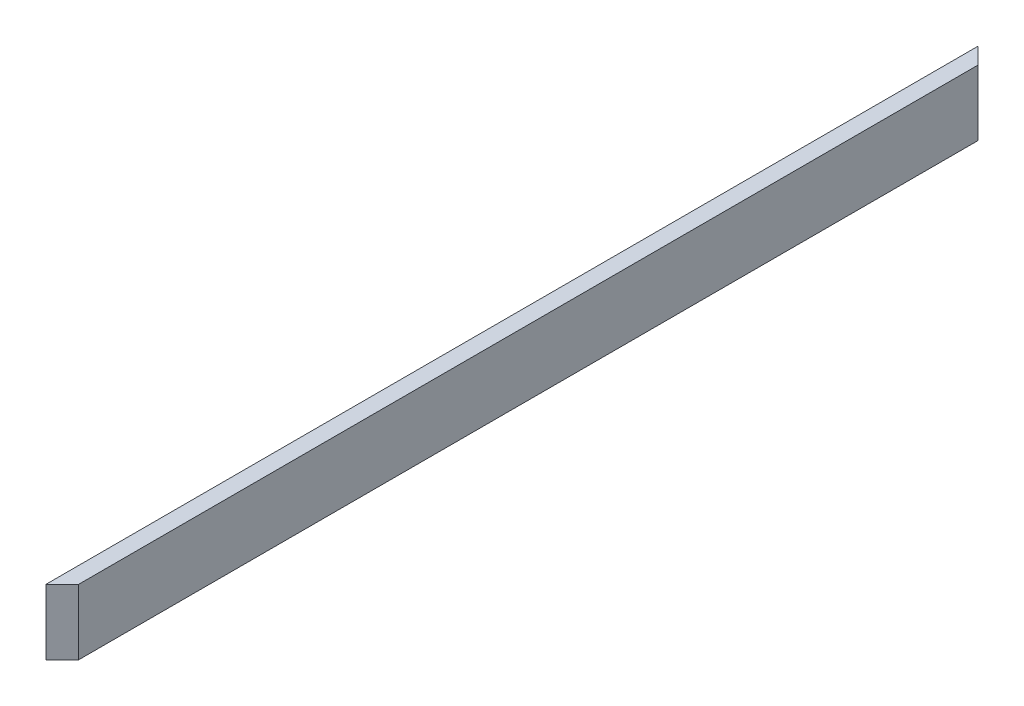
ISO-10303-21;
HEADER;
FILE_DESCRIPTION(('STEP AP214'),'2;1');
FILE_NAME('part.step','',(''),(''),'','','');
FILE_SCHEMA(('AUTOMOTIVE_DESIGN { 1 0 10303 214 1 1 1 1 }'));
ENDSEC;
DATA;
#1=APPLICATION_CONTEXT('core data for automotive mechanical design processes');
#2=APPLICATION_PROTOCOL_DEFINITION('international standard','automotive_design',2000,#1);
#3=PRODUCT_CONTEXT('',#1,'mechanical');
#4=PRODUCT('Part','Part','',(#3));
#5=PRODUCT_RELATED_PRODUCT_CATEGORY('part','',(#4));
#6=PRODUCT_DEFINITION_FORMATION('','',#4);
#7=PRODUCT_DEFINITION_CONTEXT('part definition',#1,'design');
#8=PRODUCT_DEFINITION('design','',#6,#7);
#9=PRODUCT_DEFINITION_SHAPE('','',#8);
#10=(LENGTH_UNIT() NAMED_UNIT(*) SI_UNIT(.MILLI.,.METRE.));
#11=(NAMED_UNIT(*) PLANE_ANGLE_UNIT() SI_UNIT($,.RADIAN.));
#12=(NAMED_UNIT(*) SI_UNIT($,.STERADIAN.) SOLID_ANGLE_UNIT());
#13=UNCERTAINTY_MEASURE_WITH_UNIT(LENGTH_MEASURE(1.E-05),#10,'distance_accuracy_value','');
#14=(GEOMETRIC_REPRESENTATION_CONTEXT(3) GLOBAL_UNCERTAINTY_ASSIGNED_CONTEXT((#13)) GLOBAL_UNIT_ASSIGNED_CONTEXT((#10,
#11,#12)) REPRESENTATION_CONTEXT('',''));
#15=CARTESIAN_POINT('',(0.,0.,0.));
#16=DIRECTION('',(0.,0.,1.));
#17=DIRECTION('',(1.,0.,0.));
#18=AXIS2_PLACEMENT_3D('',#15,#16,#17);
#19=CARTESIAN_POINT('',(0.,40.,300.));
#20=DIRECTION('',(0.,-1.,0.));
#21=DIRECTION('',(0.,0.,-1.));
#22=AXIS2_PLACEMENT_3D('',#19,#20,#21);
#23=PLANE('',#22);
#24=DIRECTION('',(0.707106781186543,0.,0.707106781186552));
#25=VECTOR('',#24,1.);
#26=CARTESIAN_POINT('',(0.,40.,-275.));
#27=LINE('',#26,#25);
#28=CARTESIAN_POINT('',(-9.99999999999999,40.,-285.));
#29=VERTEX_POINT('',#28);
#30=CARTESIAN_POINT('',(0.,40.,-275.));
#31=VERTEX_POINT('',#30);
#32=EDGE_CURVE('E51',#29,#31,#27,.T.);
#33=ORIENTED_EDGE('',*,*,#32,.F.);
#34=DIRECTION('',(0.,0.,-1.));
#35=VECTOR('',#34,1.);
#36=CARTESIAN_POINT('',(-10.,40.,300.));
#37=LINE('',#36,#35);
#38=CARTESIAN_POINT('',(-9.99999999999999,40.,285.));
#39=VERTEX_POINT('',#38);
#40=EDGE_CURVE('E11',#39,#29,#37,.T.);
#41=ORIENTED_EDGE('',*,*,#40,.F.);
#42=DIRECTION('',(0.707106781186543,0.,-0.707106781186552));
#43=VECTOR('',#42,1.);
#44=CARTESIAN_POINT('',(0.,40.,275.));
#45=LINE('',#44,#43);
#46=CARTESIAN_POINT('',(0.,40.,275.));
#47=VERTEX_POINT('',#46);
#48=EDGE_CURVE('E95',#39,#47,#45,.T.);
#49=ORIENTED_EDGE('',*,*,#48,.T.);
#50=DIRECTION('',(0.,0.,-1.));
#51=VECTOR('',#50,1.);
#52=CARTESIAN_POINT('',(0.,40.,300.));
#53=LINE('',#52,#51);
#54=EDGE_CURVE('E89',#47,#31,#53,.T.);
#55=ORIENTED_EDGE('',*,*,#54,.T.);
#56=EDGE_LOOP('',(#33,#41,#49,#55));
#57=FACE_BOUND('',#56,.T.);
#58=ADVANCED_FACE('F37',(#57),#23,.F.);
#59=CARTESIAN_POINT('',(-10.,40.,300.));
#60=DIRECTION('',(1.,0.,0.));
#61=DIRECTION('',(0.,1.,0.));
#62=AXIS2_PLACEMENT_3D('',#59,#60,#61);
#63=PLANE('',#62);
#64=DIRECTION('',(0.,-1.,0.));
#65=VECTOR('',#64,1.);
#66=CARTESIAN_POINT('',(-9.99999999999999,40.,-285.));
#67=LINE('',#66,#65);
#68=CARTESIAN_POINT('',(-9.99999999999999,0.,-285.));
#69=VERTEX_POINT('',#68);
#70=EDGE_CURVE('E75',#29,#69,#67,.T.);
#71=ORIENTED_EDGE('',*,*,#70,.T.);
#72=DIRECTION('',(0.,0.,-1.));
#73=VECTOR('',#72,1.);
#74=CARTESIAN_POINT('',(-9.99999999999999,0.,300.));
#75=LINE('',#74,#73);
#76=CARTESIAN_POINT('',(-9.99999999999999,0.,285.));
#77=VERTEX_POINT('',#76);
#78=EDGE_CURVE('E44',#77,#69,#75,.T.);
#79=ORIENTED_EDGE('',*,*,#78,.F.);
#80=DIRECTION('',(0.,-1.,0.));
#81=VECTOR('',#80,1.);
#82=CARTESIAN_POINT('',(-9.99999999999999,40.,285.));
#83=LINE('',#82,#81);
#84=EDGE_CURVE('E93',#39,#77,#83,.T.);
#85=ORIENTED_EDGE('',*,*,#84,.F.);
#86=ORIENTED_EDGE('',*,*,#40,.T.);
#87=EDGE_LOOP('',(#71,#79,#85,#86));
#88=FACE_BOUND('',#87,.T.);
#89=ADVANCED_FACE('F92',(#88),#63,.F.);
#90=CARTESIAN_POINT('',(-9.99999999999999,0.,300.));
#91=DIRECTION('',(0.,1.,0.));
#92=DIRECTION('',(0.,0.,1.));
#93=AXIS2_PLACEMENT_3D('',#90,#91,#92);
#94=PLANE('',#93);
#95=DIRECTION('',(-0.707106781186543,0.,-0.707106781186552));
#96=VECTOR('',#95,1.);
#97=CARTESIAN_POINT('',(282.5,0.,7.50000000000361));
#98=LINE('',#97,#96);
#99=CARTESIAN_POINT('',(0.,0.,-275.));
#100=VERTEX_POINT('',#99);
#101=EDGE_CURVE('E78',#100,#69,#98,.T.);
#102=ORIENTED_EDGE('',*,*,#101,.F.);
#103=DIRECTION('',(0.,0.,-1.));
#104=VECTOR('',#103,1.);
#105=CARTESIAN_POINT('',(0.,0.,300.));
#106=LINE('',#105,#104);
#107=CARTESIAN_POINT('',(0.,0.,275.));
#108=VERTEX_POINT('',#107);
#109=EDGE_CURVE('E102',#108,#100,#106,.T.);
#110=ORIENTED_EDGE('',*,*,#109,.F.);
#111=DIRECTION('',(-0.707106781186543,0.,0.707106781186552));
#112=VECTOR('',#111,1.);
#113=CARTESIAN_POINT('',(-17.4999999999999,0.,292.5));
#114=LINE('',#113,#112);
#115=EDGE_CURVE('E59',#108,#77,#114,.T.);
#116=ORIENTED_EDGE('',*,*,#115,.T.);
#117=ORIENTED_EDGE('',*,*,#78,.T.);
#118=EDGE_LOOP('',(#102,#110,#116,#117));
#119=FACE_BOUND('',#118,.T.);
#120=ADVANCED_FACE('F105',(#119),#94,.F.);
#121=CARTESIAN_POINT('',(0.,0.,300.));
#122=DIRECTION('',(-1.,0.,0.));
#123=DIRECTION('',(0.,0.,1.));
#124=AXIS2_PLACEMENT_3D('',#121,#122,#123);
#125=PLANE('',#124);
#126=DIRECTION('',(0.,-1.,0.));
#127=VECTOR('',#126,1.);
#128=CARTESIAN_POINT('',(0.,40.,-275.));
#129=LINE('',#128,#127);
#130=EDGE_CURVE('E82',#31,#100,#129,.T.);
#131=ORIENTED_EDGE('',*,*,#130,.F.);
#132=ORIENTED_EDGE('',*,*,#54,.F.);
#133=DIRECTION('',(0.,-1.,0.));
#134=VECTOR('',#133,1.);
#135=CARTESIAN_POINT('',(0.,40.,275.));
#136=LINE('',#135,#134);
#137=EDGE_CURVE('E94',#47,#108,#136,.T.);
#138=ORIENTED_EDGE('',*,*,#137,.T.);
#139=ORIENTED_EDGE('',*,*,#109,.T.);
#140=EDGE_LOOP('',(#131,#132,#138,#139));
#141=FACE_BOUND('',#140,.T.);
#142=ADVANCED_FACE('F108',(#141),#125,.F.);
#143=CARTESIAN_POINT('',(0.,40.,275.));
#144=DIRECTION('',(-0.707106781186552,0.,-0.707106781186543));
#145=DIRECTION('',(-0.707106781186543,0.,0.707106781186552));
#146=AXIS2_PLACEMENT_3D('',#143,#144,#145);
#147=PLANE('',#146);
#148=ORIENTED_EDGE('',*,*,#137,.F.);
#149=ORIENTED_EDGE('',*,*,#48,.F.);
#150=ORIENTED_EDGE('',*,*,#84,.T.);
#151=ORIENTED_EDGE('',*,*,#115,.F.);
#152=EDGE_LOOP('',(#148,#149,#150,#151));
#153=FACE_BOUND('',#152,.T.);
#154=ADVANCED_FACE('F109',(#153),#147,.F.);
#155=CARTESIAN_POINT('',(0.,40.,-275.));
#156=DIRECTION('',(0.707106781186552,0.,-0.707106781186543));
#157=DIRECTION('',(-0.707106781186543,0.,-0.707106781186552));
#158=AXIS2_PLACEMENT_3D('',#155,#156,#157);
#159=PLANE('',#158);
#160=ORIENTED_EDGE('',*,*,#101,.T.);
#161=ORIENTED_EDGE('',*,*,#70,.F.);
#162=ORIENTED_EDGE('',*,*,#32,.T.);
#163=ORIENTED_EDGE('',*,*,#130,.T.);
#164=EDGE_LOOP('',(#160,#161,#162,#163));
#165=FACE_BOUND('',#164,.T.);
#166=ADVANCED_FACE('F76',(#165),#159,.T.);
#167=CLOSED_SHELL('',(#58,#89,#120,#142,#154,#166));
#168=MANIFOLD_SOLID_BREP('B2',#167);
#169=ADVANCED_BREP_SHAPE_REPRESENTATION('',(#18,#168),#14);
#170=SHAPE_DEFINITION_REPRESENTATION(#9,#169);
ENDSEC;
END-ISO-10303-21;
